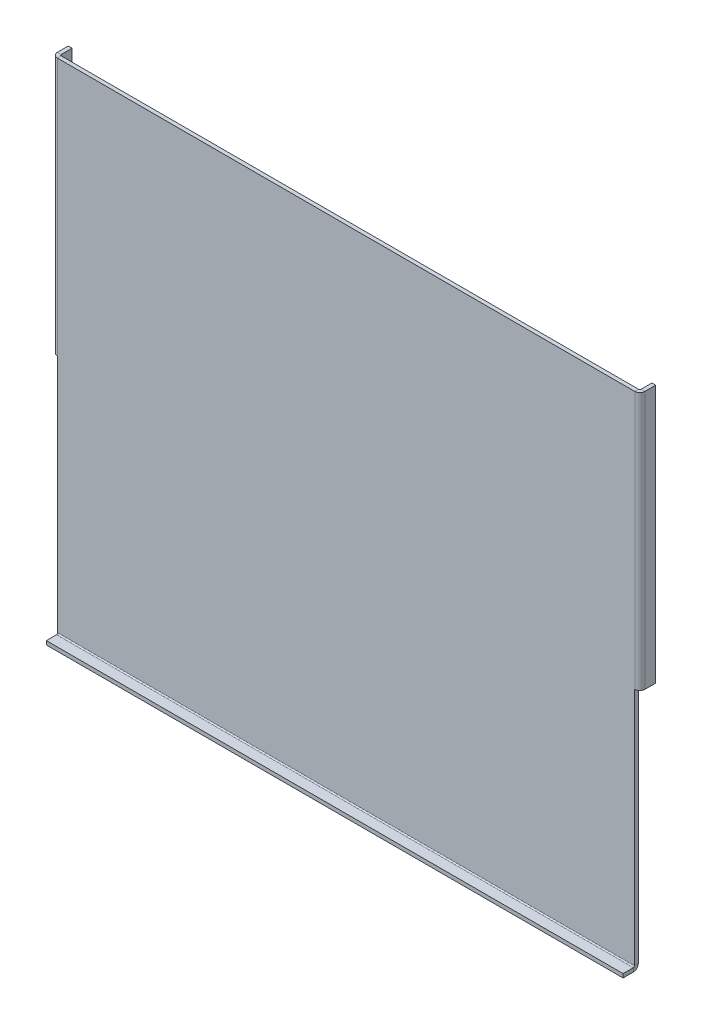
ISO-10303-21;
HEADER;
FILE_DESCRIPTION(('STEP AP214'),'2;1');
FILE_NAME('part.step','',(''),(''),'','','');
FILE_SCHEMA(('AUTOMOTIVE_DESIGN { 1 0 10303 214 1 1 1 1 }'));
ENDSEC;
DATA;
#1=APPLICATION_CONTEXT('core data for automotive mechanical design processes');
#2=APPLICATION_PROTOCOL_DEFINITION('international standard','automotive_design',2000,#1);
#3=PRODUCT_CONTEXT('',#1,'mechanical');
#4=PRODUCT('Part','Part','',(#3));
#5=PRODUCT_RELATED_PRODUCT_CATEGORY('part','',(#4));
#6=PRODUCT_DEFINITION_FORMATION('','',#4);
#7=PRODUCT_DEFINITION_CONTEXT('part definition',#1,'design');
#8=PRODUCT_DEFINITION('design','',#6,#7);
#9=PRODUCT_DEFINITION_SHAPE('','',#8);
#10=(LENGTH_UNIT() NAMED_UNIT(*) SI_UNIT(.MILLI.,.METRE.));
#11=(NAMED_UNIT(*) PLANE_ANGLE_UNIT() SI_UNIT($,.RADIAN.));
#12=(NAMED_UNIT(*) SI_UNIT($,.STERADIAN.) SOLID_ANGLE_UNIT());
#13=UNCERTAINTY_MEASURE_WITH_UNIT(LENGTH_MEASURE(1.E-05),#10,'distance_accuracy_value','');
#14=(GEOMETRIC_REPRESENTATION_CONTEXT(3) GLOBAL_UNCERTAINTY_ASSIGNED_CONTEXT((#13)) GLOBAL_UNIT_ASSIGNED_CONTEXT((#10,
#11,#12)) REPRESENTATION_CONTEXT('',''));
#15=CARTESIAN_POINT('',(0.,0.,0.));
#16=DIRECTION('',(0.,0.,1.));
#17=DIRECTION('',(1.,0.,0.));
#18=AXIS2_PLACEMENT_3D('',#15,#16,#17);
#19=CARTESIAN_POINT('',(241.3,210.185,-3.175));
#20=DIRECTION('',(1.,0.,0.));
#21=DIRECTION('',(0.,1.,0.));
#22=AXIS2_PLACEMENT_3D('',#19,#20,#21);
#23=PLANE('',#22);
#24=DIRECTION('',(0.,1.,0.));
#25=VECTOR('',#24,1.);
#26=CARTESIAN_POINT('',(241.3,210.185,-3.175));
#27=LINE('',#26,#25);
#28=CARTESIAN_POINT('',(241.3,-206.01,-3.175));
#29=VERTEX_POINT('',#28);
#30=CARTESIAN_POINT('',(241.3,-5.71500000000003,-3.17500000000002));
#31=VERTEX_POINT('',#30);
#32=EDGE_CURVE('E427',#29,#31,#27,.T.);
#33=ORIENTED_EDGE('',*,*,#32,.T.);
#34=DIRECTION('',(0.,0.,1.));
#35=VECTOR('',#34,1.);
#36=CARTESIAN_POINT('',(241.3,-5.71500000000003,-3.17500000000002));
#37=LINE('',#36,#35);
#38=CARTESIAN_POINT('',(241.3,-5.71500000000003,0.));
#39=VERTEX_POINT('',#38);
#40=EDGE_CURVE('E365',#31,#39,#37,.T.);
#41=ORIENTED_EDGE('',*,*,#40,.T.);
#42=DIRECTION('',(0.,1.,0.));
#43=VECTOR('',#42,1.);
#44=CARTESIAN_POINT('',(241.3,210.185,0.));
#45=LINE('',#44,#43);
#46=CARTESIAN_POINT('',(241.3,-206.01,0.));
#47=VERTEX_POINT('',#46);
#48=EDGE_CURVE('E424',#47,#39,#45,.T.);
#49=ORIENTED_EDGE('',*,*,#48,.F.);
#50=DIRECTION('',(0.,0.,-1.));
#51=VECTOR('',#50,1.);
#52=CARTESIAN_POINT('',(241.3,-206.01,0.));
#53=LINE('',#52,#51);
#54=EDGE_CURVE('E410',#47,#29,#53,.T.);
#55=ORIENTED_EDGE('',*,*,#54,.T.);
#56=EDGE_LOOP('',(#33,#41,#49,#55));
#57=FACE_BOUND('',#56,.T.);
#58=ADVANCED_FACE('F98',(#57),#23,.T.);
#59=CARTESIAN_POINT('',(0.,0.,-3.175));
#60=DIRECTION('',(0.,0.,1.));
#61=DIRECTION('',(1.,0.,0.));
#62=AXIS2_PLACEMENT_3D('',#59,#60,#61);
#63=PLANE('',#62);
#64=DIRECTION('',(1.,0.,0.));
#65=VECTOR('',#64,1.);
#66=CARTESIAN_POINT('',(241.3,-206.01,-3.175));
#67=LINE('',#66,#65);
#68=CARTESIAN_POINT('',(-241.3,-206.01,-3.175));
#69=VERTEX_POINT('',#68);
#70=EDGE_CURVE('E403',#29,#69,#67,.F.);
#71=ORIENTED_EDGE('',*,*,#70,.T.);
#72=DIRECTION('',(0.,-1.,0.));
#73=VECTOR('',#72,1.);
#74=CARTESIAN_POINT('',(-241.3,210.185,-3.175));
#75=LINE('',#74,#73);
#76=CARTESIAN_POINT('',(-241.3,-5.71500000000003,-3.175));
#77=VERTEX_POINT('',#76);
#78=EDGE_CURVE('E13',#77,#69,#75,.T.);
#79=ORIENTED_EDGE('',*,*,#78,.F.);
#80=DIRECTION('',(1.,0.,0.));
#81=VECTOR('',#80,1.);
#82=CARTESIAN_POINT('',(-241.57,-5.71500000000003,-3.17499999999994));
#83=LINE('',#82,#81);
#84=CARTESIAN_POINT('',(-241.57,-5.71500000000003,-3.17499999999994));
#85=VERTEX_POINT('',#84);
#86=EDGE_CURVE('E306',#85,#77,#83,.T.);
#87=ORIENTED_EDGE('',*,*,#86,.F.);
#88=DIRECTION('',(0.,1.,0.));
#89=VECTOR('',#88,1.);
#90=CARTESIAN_POINT('',(-241.57,210.185,-3.17499999999994));
#91=LINE('',#90,#89);
#92=CARTESIAN_POINT('',(-241.57,210.185,-3.17499999999994));
#93=VERTEX_POINT('',#92);
#94=EDGE_CURVE('E297',#93,#85,#91,.F.);
#95=ORIENTED_EDGE('',*,*,#94,.F.);
#96=DIRECTION('',(-1.,0.,0.));
#97=VECTOR('',#96,1.);
#98=CARTESIAN_POINT('',(-241.3,210.185,-3.175));
#99=LINE('',#98,#97);
#100=CARTESIAN_POINT('',(241.57,210.185,-3.17500000000003));
#101=VERTEX_POINT('',#100);
#102=EDGE_CURVE('E106',#101,#93,#99,.T.);
#103=ORIENTED_EDGE('',*,*,#102,.F.);
#104=DIRECTION('',(0.,-1.,0.));
#105=VECTOR('',#104,1.);
#106=CARTESIAN_POINT('',(241.57,-5.71500000000003,-3.17500000000003));
#107=LINE('',#106,#105);
#108=CARTESIAN_POINT('',(241.57,-5.71500000000003,-3.17500000000003));
#109=VERTEX_POINT('',#108);
#110=EDGE_CURVE('E358',#109,#101,#107,.F.);
#111=ORIENTED_EDGE('',*,*,#110,.F.);
#112=DIRECTION('',(-1.,0.,0.));
#113=VECTOR('',#112,1.);
#114=CARTESIAN_POINT('',(241.57,-5.71500000000003,-3.17500000000003));
#115=LINE('',#114,#113);
#116=EDGE_CURVE('E369',#109,#31,#115,.T.);
#117=ORIENTED_EDGE('',*,*,#116,.T.);
#118=ORIENTED_EDGE('',*,*,#32,.F.);
#119=EDGE_LOOP('',(#71,#79,#87,#95,#103,#111,#117,#118));
#120=FACE_BOUND('',#119,.T.);
#121=ADVANCED_FACE('F476',(#120),#63,.F.);
#122=CARTESIAN_POINT('',(0.,0.,0.));
#123=DIRECTION('',(0.,0.,1.));
#124=DIRECTION('',(1.,0.,0.));
#125=AXIS2_PLACEMENT_3D('',#122,#123,#124);
#126=PLANE('',#125);
#127=DIRECTION('',(-1.,0.,0.));
#128=VECTOR('',#127,1.);
#129=CARTESIAN_POINT('',(-241.3,210.185,0.));
#130=LINE('',#129,#128);
#131=CARTESIAN_POINT('',(241.57,210.185,0.));
#132=VERTEX_POINT('',#131);
#133=CARTESIAN_POINT('',(-241.57,210.185,0.));
#134=VERTEX_POINT('',#133);
#135=EDGE_CURVE('E433',#132,#134,#130,.T.);
#136=ORIENTED_EDGE('',*,*,#135,.T.);
#137=DIRECTION('',(0.,1.,0.));
#138=VECTOR('',#137,1.);
#139=CARTESIAN_POINT('',(-241.57,210.185,0.));
#140=LINE('',#139,#138);
#141=CARTESIAN_POINT('',(-241.57,-5.71500000000003,0.));
#142=VERTEX_POINT('',#141);
#143=EDGE_CURVE('E243',#134,#142,#140,.F.);
#144=ORIENTED_EDGE('',*,*,#143,.T.);
#145=DIRECTION('',(1.,0.,0.));
#146=VECTOR('',#145,1.);
#147=CARTESIAN_POINT('',(-241.57,-5.71500000000003,0.));
#148=LINE('',#147,#146);
#149=CARTESIAN_POINT('',(-241.3,-5.71500000000003,0.));
#150=VERTEX_POINT('',#149);
#151=EDGE_CURVE('E307',#142,#150,#148,.T.);
#152=ORIENTED_EDGE('',*,*,#151,.T.);
#153=DIRECTION('',(0.,-1.,0.));
#154=VECTOR('',#153,1.);
#155=CARTESIAN_POINT('',(-241.3,210.185,0.));
#156=LINE('',#155,#154);
#157=CARTESIAN_POINT('',(-241.3,-206.01,0.));
#158=VERTEX_POINT('',#157);
#159=EDGE_CURVE('E101',#150,#158,#156,.T.);
#160=ORIENTED_EDGE('',*,*,#159,.T.);
#161=DIRECTION('',(1.,0.,0.));
#162=VECTOR('',#161,1.);
#163=CARTESIAN_POINT('',(241.3,-206.01,0.));
#164=LINE('',#163,#162);
#165=EDGE_CURVE('E416',#47,#158,#164,.F.);
#166=ORIENTED_EDGE('',*,*,#165,.F.);
#167=ORIENTED_EDGE('',*,*,#48,.T.);
#168=DIRECTION('',(-1.,0.,0.));
#169=VECTOR('',#168,1.);
#170=CARTESIAN_POINT('',(241.57,-5.71500000000003,0.));
#171=LINE('',#170,#169);
#172=CARTESIAN_POINT('',(241.57,-5.71500000000003,0.));
#173=VERTEX_POINT('',#172);
#174=EDGE_CURVE('E121',#173,#39,#171,.T.);
#175=ORIENTED_EDGE('',*,*,#174,.F.);
#176=DIRECTION('',(0.,-1.,0.));
#177=VECTOR('',#176,1.);
#178=CARTESIAN_POINT('',(241.57,-5.71500000000003,0.));
#179=LINE('',#178,#177);
#180=EDGE_CURVE('E345',#173,#132,#179,.F.);
#181=ORIENTED_EDGE('',*,*,#180,.T.);
#182=EDGE_LOOP('',(#136,#144,#152,#160,#166,#167,#175,#181));
#183=FACE_BOUND('',#182,.T.);
#184=ADVANCED_FACE('F437',(#183),#126,.T.);
#185=CARTESIAN_POINT('',(-241.3,210.185,-3.175));
#186=DIRECTION('',(-1.,0.,0.));
#187=DIRECTION('',(0.,-1.,0.));
#188=AXIS2_PLACEMENT_3D('',#185,#186,#187);
#189=PLANE('',#188);
#190=DIRECTION('',(0.,0.,1.));
#191=VECTOR('',#190,1.);
#192=CARTESIAN_POINT('',(-241.3,-5.71500000000003,-3.17499999999994));
#193=LINE('',#192,#191);
#194=EDGE_CURVE('E113',#77,#150,#193,.T.);
#195=ORIENTED_EDGE('',*,*,#194,.F.);
#196=ORIENTED_EDGE('',*,*,#78,.T.);
#197=DIRECTION('',(0.,0.,-1.));
#198=VECTOR('',#197,1.);
#199=CARTESIAN_POINT('',(-241.3,-206.01,0.));
#200=LINE('',#199,#198);
#201=EDGE_CURVE('E421',#158,#69,#200,.T.);
#202=ORIENTED_EDGE('',*,*,#201,.F.);
#203=ORIENTED_EDGE('',*,*,#159,.F.);
#204=EDGE_LOOP('',(#195,#196,#202,#203));
#205=FACE_BOUND('',#204,.T.);
#206=ADVANCED_FACE('F440',(#205),#189,.T.);
#207=CARTESIAN_POINT('',(-241.3,210.185,-3.175));
#208=DIRECTION('',(0.,1.,0.));
#209=DIRECTION('',(0.,0.,1.));
#210=AXIS2_PLACEMENT_3D('',#207,#208,#209);
#211=PLANE('',#210);
#212=ORIENTED_EDGE('',*,*,#135,.F.);
#213=DIRECTION('',(0.,0.,1.));
#214=VECTOR('',#213,1.);
#215=CARTESIAN_POINT('',(241.57,210.185,-3.17500000000003));
#216=LINE('',#215,#214);
#217=EDGE_CURVE('E362',#101,#132,#216,.T.);
#218=ORIENTED_EDGE('',*,*,#217,.F.);
#219=ORIENTED_EDGE('',*,*,#102,.T.);
#220=DIRECTION('',(0.,0.,1.));
#221=VECTOR('',#220,1.);
#222=CARTESIAN_POINT('',(-241.57,210.185,-3.17499999999994));
#223=LINE('',#222,#221);
#224=EDGE_CURVE('E293',#93,#134,#223,.T.);
#225=ORIENTED_EDGE('',*,*,#224,.T.);
#226=EDGE_LOOP('',(#212,#218,#219,#225));
#227=FACE_BOUND('',#226,.T.);
#228=ADVANCED_FACE('F513',(#227),#211,.T.);
#229=CARTESIAN_POINT('',(-241.3,-206.01,1.));
#230=DIRECTION('',(-1.,0.,0.));
#231=DIRECTION('',(0.,0.,1.));
#232=AXIS2_PLACEMENT_3D('',#229,#230,#231);
#233=PLANE('',#232);
#234=DIRECTION('',(0.,-1.,0.));
#235=VECTOR('',#234,1.);
#236=CARTESIAN_POINT('',(-241.3,-210.185,0.999999999999992));
#237=LINE('',#236,#235);
#238=CARTESIAN_POINT('',(-241.3,-207.01,1.));
#239=VERTEX_POINT('',#238);
#240=CARTESIAN_POINT('',(-241.3,-210.185,0.999999999999992));
#241=VERTEX_POINT('',#240);
#242=EDGE_CURVE('E371',#239,#241,#237,.T.);
#243=ORIENTED_EDGE('',*,*,#242,.F.);
#244=CARTESIAN_POINT('',(-241.3,-206.01,1.));
#245=DIRECTION('',(1.,0.,0.));
#246=DIRECTION('',(0.,0.,-1.));
#247=AXIS2_PLACEMENT_3D('',#244,#245,#246);
#248=CIRCLE('',#247,1.);
#249=EDGE_CURVE('E413',#158,#239,#248,.F.);
#250=ORIENTED_EDGE('',*,*,#249,.F.);
#251=ORIENTED_EDGE('',*,*,#201,.T.);
#252=CARTESIAN_POINT('',(-241.3,-206.01,1.));
#253=DIRECTION('',(1.,0.,0.));
#254=DIRECTION('',(0.,0.,-1.));
#255=AXIS2_PLACEMENT_3D('',#252,#253,#254);
#256=CIRCLE('',#255,4.175);
#257=EDGE_CURVE('E406',#69,#241,#256,.F.);
#258=ORIENTED_EDGE('',*,*,#257,.T.);
#259=EDGE_LOOP('',(#243,#250,#251,#258));
#260=FACE_BOUND('',#259,.T.);
#261=ADVANCED_FACE('F448',(#260),#233,.T.);
#262=CARTESIAN_POINT('',(241.3,-206.01,1.));
#263=DIRECTION('',(-1.,0.,0.));
#264=DIRECTION('',(0.,0.,1.));
#265=AXIS2_PLACEMENT_3D('',#262,#263,#264);
#266=PLANE('',#265);
#267=CARTESIAN_POINT('',(241.3,-206.01,1.));
#268=DIRECTION('',(1.,0.,0.));
#269=DIRECTION('',(0.,0.,-1.));
#270=AXIS2_PLACEMENT_3D('',#267,#268,#269);
#271=CIRCLE('',#270,1.);
#272=CARTESIAN_POINT('',(241.3,-207.01,1.));
#273=VERTEX_POINT('',#272);
#274=EDGE_CURVE('E374',#273,#47,#271,.T.);
#275=ORIENTED_EDGE('',*,*,#274,.F.);
#276=DIRECTION('',(0.,-1.,0.));
#277=VECTOR('',#276,1.);
#278=CARTESIAN_POINT('',(241.3,-207.01,1.));
#279=LINE('',#278,#277);
#280=CARTESIAN_POINT('',(241.3,-210.185,0.999999999999992));
#281=VERTEX_POINT('',#280);
#282=EDGE_CURVE('E396',#273,#281,#279,.T.);
#283=ORIENTED_EDGE('',*,*,#282,.T.);
#284=CARTESIAN_POINT('',(241.3,-206.01,1.));
#285=DIRECTION('',(1.,0.,0.));
#286=DIRECTION('',(0.,0.,-1.));
#287=AXIS2_PLACEMENT_3D('',#284,#285,#286);
#288=CIRCLE('',#287,4.175);
#289=EDGE_CURVE('E407',#281,#29,#288,.T.);
#290=ORIENTED_EDGE('',*,*,#289,.T.);
#291=ORIENTED_EDGE('',*,*,#54,.F.);
#292=EDGE_LOOP('',(#275,#283,#290,#291));
#293=FACE_BOUND('',#292,.T.);
#294=ADVANCED_FACE('F469',(#293),#266,.F.);
#295=CARTESIAN_POINT('',(241.3,-206.01,1.));
#296=DIRECTION('',(1.,0.,0.));
#297=DIRECTION('',(0.,-1.,0.));
#298=AXIS2_PLACEMENT_3D('',#295,#296,#297);
#299=CYLINDRICAL_SURFACE('',#298,4.175);
#300=ORIENTED_EDGE('',*,*,#70,.F.);
#301=ORIENTED_EDGE('',*,*,#289,.F.);
#302=DIRECTION('',(1.,0.,0.));
#303=VECTOR('',#302,1.);
#304=CARTESIAN_POINT('',(-241.3,-210.185,0.999999999999992));
#305=LINE('',#304,#303);
#306=EDGE_CURVE('E394',#281,#241,#305,.F.);
#307=ORIENTED_EDGE('',*,*,#306,.T.);
#308=ORIENTED_EDGE('',*,*,#257,.F.);
#309=EDGE_LOOP('',(#300,#301,#307,#308));
#310=FACE_BOUND('',#309,.T.);
#311=ADVANCED_FACE('F474',(#310),#299,.T.);
#312=CARTESIAN_POINT('',(241.3,-206.01,1.));
#313=DIRECTION('',(1.,0.,0.));
#314=DIRECTION('',(0.,-1.,0.));
#315=AXIS2_PLACEMENT_3D('',#312,#313,#314);
#316=CYLINDRICAL_SURFACE('',#315,1.);
#317=ORIENTED_EDGE('',*,*,#165,.T.);
#318=ORIENTED_EDGE('',*,*,#249,.T.);
#319=DIRECTION('',(1.,0.,0.));
#320=VECTOR('',#319,1.);
#321=CARTESIAN_POINT('',(-241.3,-207.01,1.));
#322=LINE('',#321,#320);
#323=EDGE_CURVE('E399',#239,#273,#322,.T.);
#324=ORIENTED_EDGE('',*,*,#323,.T.);
#325=ORIENTED_EDGE('',*,*,#274,.T.);
#326=EDGE_LOOP('',(#317,#318,#324,#325));
#327=FACE_BOUND('',#326,.T.);
#328=ADVANCED_FACE('F445',(#327),#316,.F.);
#329=CARTESIAN_POINT('',(241.3,-210.185,9.52499999999994));
#330=DIRECTION('',(1.,0.,0.));
#331=DIRECTION('',(0.,0.,-1.));
#332=AXIS2_PLACEMENT_3D('',#329,#330,#331);
#333=PLANE('',#332);
#334=DIRECTION('',(0.,0.,1.));
#335=VECTOR('',#334,1.);
#336=CARTESIAN_POINT('',(241.3,-210.185,9.52499999999994));
#337=LINE('',#336,#335);
#338=CARTESIAN_POINT('',(241.3,-210.185,9.52499999999994));
#339=VERTEX_POINT('',#338);
#340=EDGE_CURVE('E378',#339,#281,#337,.F.);
#341=ORIENTED_EDGE('',*,*,#340,.T.);
#342=ORIENTED_EDGE('',*,*,#282,.F.);
#343=DIRECTION('',(0.,0.,-1.));
#344=VECTOR('',#343,1.);
#345=CARTESIAN_POINT('',(241.3,-207.01,0.));
#346=LINE('',#345,#344);
#347=CARTESIAN_POINT('',(241.3,-207.01,9.52499999999995));
#348=VERTEX_POINT('',#347);
#349=EDGE_CURVE('E386',#348,#273,#346,.T.);
#350=ORIENTED_EDGE('',*,*,#349,.F.);
#351=DIRECTION('',(0.,1.,0.));
#352=VECTOR('',#351,1.);
#353=CARTESIAN_POINT('',(241.3,-210.185,9.52499999999994));
#354=LINE('',#353,#352);
#355=EDGE_CURVE('E372',#339,#348,#354,.T.);
#356=ORIENTED_EDGE('',*,*,#355,.F.);
#357=EDGE_LOOP('',(#341,#342,#350,#356));
#358=FACE_BOUND('',#357,.T.);
#359=ADVANCED_FACE('F467',(#358),#333,.T.);
#360=CARTESIAN_POINT('',(-241.3,-210.185,0.));
#361=DIRECTION('',(-1.,0.,0.));
#362=DIRECTION('',(0.,0.,1.));
#363=AXIS2_PLACEMENT_3D('',#360,#361,#362);
#364=PLANE('',#363);
#365=DIRECTION('',(0.,0.,1.));
#366=VECTOR('',#365,1.);
#367=CARTESIAN_POINT('',(-241.3,-207.01,-6.12473035251548E-13));
#368=LINE('',#367,#366);
#369=CARTESIAN_POINT('',(-241.3,-207.01,9.52500000000001));
#370=VERTEX_POINT('',#369);
#371=EDGE_CURVE('E392',#239,#370,#368,.T.);
#372=ORIENTED_EDGE('',*,*,#371,.F.);
#373=ORIENTED_EDGE('',*,*,#242,.T.);
#374=DIRECTION('',(0.,0.,-1.));
#375=VECTOR('',#374,1.);
#376=CARTESIAN_POINT('',(-241.3,-210.185,0.));
#377=LINE('',#376,#375);
#378=CARTESIAN_POINT('',(-241.3,-210.185,9.525));
#379=VERTEX_POINT('',#378);
#380=EDGE_CURVE('E384',#241,#379,#377,.F.);
#381=ORIENTED_EDGE('',*,*,#380,.T.);
#382=DIRECTION('',(0.,1.,0.));
#383=VECTOR('',#382,1.);
#384=CARTESIAN_POINT('',(-241.3,-210.185,9.525));
#385=LINE('',#384,#383);
#386=EDGE_CURVE('E375',#379,#370,#385,.T.);
#387=ORIENTED_EDGE('',*,*,#386,.T.);
#388=EDGE_LOOP('',(#372,#373,#381,#387));
#389=FACE_BOUND('',#388,.T.);
#390=ADVANCED_FACE('F452',(#389),#364,.T.);
#391=CARTESIAN_POINT('',(0.,-210.185,-6.23558488502375E-13));
#392=DIRECTION('',(0.,1.,0.));
#393=DIRECTION('',(0.,0.,1.));
#394=AXIS2_PLACEMENT_3D('',#391,#392,#393);
#395=PLANE('',#394);
#396=ORIENTED_EDGE('',*,*,#306,.F.);
#397=ORIENTED_EDGE('',*,*,#340,.F.);
#398=DIRECTION('',(-1.,0.,0.));
#399=VECTOR('',#398,1.);
#400=CARTESIAN_POINT('',(-241.3,-210.185,9.525));
#401=LINE('',#400,#399);
#402=EDGE_CURVE('E381',#379,#339,#401,.F.);
#403=ORIENTED_EDGE('',*,*,#402,.F.);
#404=ORIENTED_EDGE('',*,*,#380,.F.);
#405=EDGE_LOOP('',(#396,#397,#403,#404));
#406=FACE_BOUND('',#405,.T.);
#407=ADVANCED_FACE('F457',(#406),#395,.F.);
#408=CARTESIAN_POINT('',(0.,-207.01,-6.12473035251548E-13));
#409=DIRECTION('',(0.,1.,0.));
#410=DIRECTION('',(0.,0.,1.));
#411=AXIS2_PLACEMENT_3D('',#408,#409,#410);
#412=PLANE('',#411);
#413=ORIENTED_EDGE('',*,*,#349,.T.);
#414=ORIENTED_EDGE('',*,*,#323,.F.);
#415=ORIENTED_EDGE('',*,*,#371,.T.);
#416=DIRECTION('',(1.,0.,0.));
#417=VECTOR('',#416,1.);
#418=CARTESIAN_POINT('',(0.,-207.01,9.52499999999998));
#419=LINE('',#418,#417);
#420=EDGE_CURVE('E389',#370,#348,#419,.T.);
#421=ORIENTED_EDGE('',*,*,#420,.T.);
#422=EDGE_LOOP('',(#413,#414,#415,#421));
#423=FACE_BOUND('',#422,.T.);
#424=ADVANCED_FACE('F464',(#423),#412,.T.);
#425=CARTESIAN_POINT('',(-241.3,-210.185,9.525));
#426=DIRECTION('',(0.,0.,1.));
#427=DIRECTION('',(0.,-1.,0.));
#428=AXIS2_PLACEMENT_3D('',#425,#426,#427);
#429=PLANE('',#428);
#430=ORIENTED_EDGE('',*,*,#420,.F.);
#431=ORIENTED_EDGE('',*,*,#386,.F.);
#432=ORIENTED_EDGE('',*,*,#402,.T.);
#433=ORIENTED_EDGE('',*,*,#355,.T.);
#434=EDGE_LOOP('',(#430,#431,#432,#433));
#435=FACE_BOUND('',#434,.T.);
#436=ADVANCED_FACE('F461',(#435),#429,.T.);
#437=CARTESIAN_POINT('',(241.57,-5.71500000000003,-3.17500000000003));
#438=DIRECTION('',(0.,-1.,0.));
#439=DIRECTION('',(0.,0.,1.));
#440=AXIS2_PLACEMENT_3D('',#437,#438,#439);
#441=PLANE('',#440);
#442=ORIENTED_EDGE('',*,*,#116,.F.);
#443=DIRECTION('',(0.,0.,1.));
#444=VECTOR('',#443,1.);
#445=CARTESIAN_POINT('',(241.57,-5.71500000000003,-3.17500000000003));
#446=LINE('',#445,#444);
#447=EDGE_CURVE('E352',#109,#173,#446,.T.);
#448=ORIENTED_EDGE('',*,*,#447,.T.);
#449=ORIENTED_EDGE('',*,*,#174,.T.);
#450=ORIENTED_EDGE('',*,*,#40,.F.);
#451=EDGE_LOOP('',(#442,#448,#449,#450));
#452=FACE_BOUND('',#451,.T.);
#453=ADVANCED_FACE('F481',(#452),#441,.T.);
#454=CARTESIAN_POINT('',(241.57,210.185,-4.175));
#455=DIRECTION('',(0.,1.,0.));
#456=DIRECTION('',(0.,0.,1.));
#457=AXIS2_PLACEMENT_3D('',#454,#455,#456);
#458=PLANE('',#457);
#459=DIRECTION('',(1.,0.,0.));
#460=VECTOR('',#459,1.);
#461=CARTESIAN_POINT('',(245.745,210.185,-4.175));
#462=LINE('',#461,#460);
#463=CARTESIAN_POINT('',(242.57,210.185,-4.175));
#464=VERTEX_POINT('',#463);
#465=CARTESIAN_POINT('',(245.745,210.185,-4.17499999999999));
#466=VERTEX_POINT('',#465);
#467=EDGE_CURVE('E310',#464,#466,#462,.T.);
#468=ORIENTED_EDGE('',*,*,#467,.F.);
#469=CARTESIAN_POINT('',(241.57,210.185,-4.175));
#470=DIRECTION('',(0.,-1.,0.));
#471=DIRECTION('',(0.,0.,-1.));
#472=AXIS2_PLACEMENT_3D('',#469,#470,#471);
#473=CIRCLE('',#472,0.999999999999973);
#474=EDGE_CURVE('E355',#101,#464,#473,.F.);
#475=ORIENTED_EDGE('',*,*,#474,.F.);
#476=ORIENTED_EDGE('',*,*,#217,.T.);
#477=CARTESIAN_POINT('',(241.57,210.185,-4.175));
#478=DIRECTION('',(0.,-1.,0.));
#479=DIRECTION('',(0.,0.,-1.));
#480=AXIS2_PLACEMENT_3D('',#477,#478,#479);
#481=CIRCLE('',#480,4.17499999999997);
#482=EDGE_CURVE('E348',#132,#466,#481,.F.);
#483=ORIENTED_EDGE('',*,*,#482,.T.);
#484=EDGE_LOOP('',(#468,#475,#476,#483));
#485=FACE_BOUND('',#484,.T.);
#486=ADVANCED_FACE('F510',(#485),#458,.T.);
#487=CARTESIAN_POINT('',(241.57,-5.71500000000003,-4.175));
#488=DIRECTION('',(0.,1.,0.));
#489=DIRECTION('',(0.,0.,1.));
#490=AXIS2_PLACEMENT_3D('',#487,#488,#489);
#491=PLANE('',#490);
#492=CARTESIAN_POINT('',(241.57,-5.71500000000003,-4.175));
#493=DIRECTION('',(0.,-1.,0.));
#494=DIRECTION('',(0.,0.,-1.));
#495=AXIS2_PLACEMENT_3D('',#492,#493,#494);
#496=CIRCLE('',#495,0.999999999999973);
#497=CARTESIAN_POINT('',(242.57,-5.71500000000003,-4.175));
#498=VERTEX_POINT('',#497);
#499=EDGE_CURVE('E315',#498,#109,#496,.T.);
#500=ORIENTED_EDGE('',*,*,#499,.F.);
#501=DIRECTION('',(1.,0.,0.));
#502=VECTOR('',#501,1.);
#503=CARTESIAN_POINT('',(242.57,-5.71500000000003,-4.17499999999998));
#504=LINE('',#503,#502);
#505=CARTESIAN_POINT('',(245.745,-5.71500000000002,-4.17499999999998));
#506=VERTEX_POINT('',#505);
#507=EDGE_CURVE('E338',#498,#506,#504,.T.);
#508=ORIENTED_EDGE('',*,*,#507,.T.);
#509=CARTESIAN_POINT('',(241.57,-5.71500000000003,-4.175));
#510=DIRECTION('',(0.,-1.,0.));
#511=DIRECTION('',(0.,0.,-1.));
#512=AXIS2_PLACEMENT_3D('',#509,#510,#511);
#513=CIRCLE('',#512,4.17499999999997);
#514=EDGE_CURVE('E349',#506,#173,#513,.T.);
#515=ORIENTED_EDGE('',*,*,#514,.T.);
#516=ORIENTED_EDGE('',*,*,#447,.F.);
#517=EDGE_LOOP('',(#500,#508,#515,#516));
#518=FACE_BOUND('',#517,.T.);
#519=ADVANCED_FACE('F484',(#518),#491,.F.);
#520=CARTESIAN_POINT('',(241.57,-5.71500000000003,-4.175));
#521=DIRECTION('',(0.,-1.,0.));
#522=DIRECTION('',(1.,0.,0.));
#523=AXIS2_PLACEMENT_3D('',#520,#521,#522);
#524=CYLINDRICAL_SURFACE('',#523,4.17499999999997);
#525=ORIENTED_EDGE('',*,*,#180,.F.);
#526=ORIENTED_EDGE('',*,*,#514,.F.);
#527=DIRECTION('',(0.,-1.,0.));
#528=VECTOR('',#527,1.);
#529=CARTESIAN_POINT('',(245.745,0.,-4.17499999999998));
#530=LINE('',#529,#528);
#531=EDGE_CURVE('E335',#466,#506,#530,.T.);
#532=ORIENTED_EDGE('',*,*,#531,.F.);
#533=ORIENTED_EDGE('',*,*,#482,.F.);
#534=EDGE_LOOP('',(#525,#526,#532,#533));
#535=FACE_BOUND('',#534,.T.);
#536=ADVANCED_FACE('F508',(#535),#524,.T.);
#537=CARTESIAN_POINT('',(241.57,-5.71500000000003,-4.175));
#538=DIRECTION('',(0.,-1.,0.));
#539=DIRECTION('',(1.,0.,0.));
#540=AXIS2_PLACEMENT_3D('',#537,#538,#539);
#541=CYLINDRICAL_SURFACE('',#540,0.999999999999973);
#542=ORIENTED_EDGE('',*,*,#110,.T.);
#543=ORIENTED_EDGE('',*,*,#474,.T.);
#544=DIRECTION('',(0.,1.,0.));
#545=VECTOR('',#544,1.);
#546=CARTESIAN_POINT('',(242.57,210.185,-4.17500000000001));
#547=LINE('',#546,#545);
#548=EDGE_CURVE('E341',#464,#498,#547,.F.);
#549=ORIENTED_EDGE('',*,*,#548,.T.);
#550=ORIENTED_EDGE('',*,*,#499,.T.);
#551=EDGE_LOOP('',(#542,#543,#549,#550));
#552=FACE_BOUND('',#551,.T.);
#553=ADVANCED_FACE('F486',(#552),#541,.F.);
#554=CARTESIAN_POINT('',(245.745,-5.71500000000002,-3.17499999999995));
#555=DIRECTION('',(0.,-1.,0.));
#556=DIRECTION('',(1.,0.,0.));
#557=AXIS2_PLACEMENT_3D('',#554,#555,#556);
#558=PLANE('',#557);
#559=DIRECTION('',(0.,0.,1.));
#560=VECTOR('',#559,1.);
#561=CARTESIAN_POINT('',(245.745,-5.71500000000002,-3.17499999999995));
#562=LINE('',#561,#560);
#563=CARTESIAN_POINT('',(245.745,-5.71500000000002,-13.295953566832));
#564=VERTEX_POINT('',#563);
#565=EDGE_CURVE('E319',#564,#506,#562,.T.);
#566=ORIENTED_EDGE('',*,*,#565,.T.);
#567=ORIENTED_EDGE('',*,*,#507,.F.);
#568=DIRECTION('',(0.,0.,-1.));
#569=VECTOR('',#568,1.);
#570=CARTESIAN_POINT('',(242.57,-5.71500000000003,6.61738081478781E-13));
#571=LINE('',#570,#569);
#572=CARTESIAN_POINT('',(242.57,-5.71500000000003,-13.295953566832));
#573=VERTEX_POINT('',#572);
#574=EDGE_CURVE('E327',#573,#498,#571,.F.);
#575=ORIENTED_EDGE('',*,*,#574,.F.);
#576=DIRECTION('',(-1.,0.,0.));
#577=VECTOR('',#576,1.);
#578=CARTESIAN_POINT('',(245.745,-5.71500000000002,-13.295953566832));
#579=LINE('',#578,#577);
#580=EDGE_CURVE('E313',#564,#573,#579,.T.);
#581=ORIENTED_EDGE('',*,*,#580,.F.);
#582=EDGE_LOOP('',(#566,#567,#575,#581));
#583=FACE_BOUND('',#582,.T.);
#584=ADVANCED_FACE('F503',(#583),#558,.T.);
#585=CARTESIAN_POINT('',(245.745,210.185,-13.295953566832));
#586=DIRECTION('',(0.,1.,0.));
#587=DIRECTION('',(0.,0.,1.));
#588=AXIS2_PLACEMENT_3D('',#585,#586,#587);
#589=PLANE('',#588);
#590=DIRECTION('',(0.,0.,1.));
#591=VECTOR('',#590,1.);
#592=CARTESIAN_POINT('',(242.57,210.185,2.39096417334307E-12));
#593=LINE('',#592,#591);
#594=CARTESIAN_POINT('',(242.57,210.185,-13.295953566832));
#595=VERTEX_POINT('',#594);
#596=EDGE_CURVE('E333',#464,#595,#593,.F.);
#597=ORIENTED_EDGE('',*,*,#596,.F.);
#598=ORIENTED_EDGE('',*,*,#467,.T.);
#599=DIRECTION('',(0.,0.,-1.));
#600=VECTOR('',#599,1.);
#601=CARTESIAN_POINT('',(245.745,210.185,-13.295953566832));
#602=LINE('',#601,#600);
#603=CARTESIAN_POINT('',(245.745,210.185,-13.295953566832));
#604=VERTEX_POINT('',#603);
#605=EDGE_CURVE('E325',#466,#604,#602,.T.);
#606=ORIENTED_EDGE('',*,*,#605,.T.);
#607=DIRECTION('',(-1.,0.,0.));
#608=VECTOR('',#607,1.);
#609=CARTESIAN_POINT('',(245.745,210.185,-13.295953566832));
#610=LINE('',#609,#608);
#611=EDGE_CURVE('E316',#604,#595,#610,.T.);
#612=ORIENTED_EDGE('',*,*,#611,.T.);
#613=EDGE_LOOP('',(#597,#598,#606,#612));
#614=FACE_BOUND('',#613,.T.);
#615=ADVANCED_FACE('F495',(#614),#589,.T.);
#616=CARTESIAN_POINT('',(245.745,0.,6.72823534729608E-13));
#617=DIRECTION('',(1.,0.,0.));
#618=DIRECTION('',(0.,0.,-1.));
#619=AXIS2_PLACEMENT_3D('',#616,#617,#618);
#620=PLANE('',#619);
#621=ORIENTED_EDGE('',*,*,#605,.F.);
#622=ORIENTED_EDGE('',*,*,#531,.T.);
#623=ORIENTED_EDGE('',*,*,#565,.F.);
#624=DIRECTION('',(0.,-1.,0.));
#625=VECTOR('',#624,1.);
#626=CARTESIAN_POINT('',(245.745,-5.71500000000002,-13.295953566832));
#627=LINE('',#626,#625);
#628=EDGE_CURVE('E322',#604,#564,#627,.T.);
#629=ORIENTED_EDGE('',*,*,#628,.F.);
#630=EDGE_LOOP('',(#621,#622,#623,#629));
#631=FACE_BOUND('',#630,.T.);
#632=ADVANCED_FACE('F506',(#631),#620,.T.);
#633=CARTESIAN_POINT('',(242.57,0.,6.61738081478781E-13));
#634=DIRECTION('',(1.,0.,0.));
#635=DIRECTION('',(0.,0.,-1.));
#636=AXIS2_PLACEMENT_3D('',#633,#634,#635);
#637=PLANE('',#636);
#638=ORIENTED_EDGE('',*,*,#548,.F.);
#639=ORIENTED_EDGE('',*,*,#596,.T.);
#640=DIRECTION('',(0.,1.,0.));
#641=VECTOR('',#640,1.);
#642=CARTESIAN_POINT('',(242.57,0.,-13.295953566832));
#643=LINE('',#642,#641);
#644=EDGE_CURVE('E330',#595,#573,#643,.F.);
#645=ORIENTED_EDGE('',*,*,#644,.T.);
#646=ORIENTED_EDGE('',*,*,#574,.T.);
#647=EDGE_LOOP('',(#638,#639,#645,#646));
#648=FACE_BOUND('',#647,.T.);
#649=ADVANCED_FACE('F491',(#648),#637,.F.);
#650=CARTESIAN_POINT('',(245.745,-5.71500000000002,-13.295953566832));
#651=DIRECTION('',(0.,0.,-1.));
#652=DIRECTION('',(-1.,0.,0.));
#653=AXIS2_PLACEMENT_3D('',#650,#651,#652);
#654=PLANE('',#653);
#655=ORIENTED_EDGE('',*,*,#644,.F.);
#656=ORIENTED_EDGE('',*,*,#611,.F.);
#657=ORIENTED_EDGE('',*,*,#628,.T.);
#658=ORIENTED_EDGE('',*,*,#580,.T.);
#659=EDGE_LOOP('',(#655,#656,#657,#658));
#660=FACE_BOUND('',#659,.T.);
#661=ADVANCED_FACE('F501',(#660),#654,.T.);
#662=CARTESIAN_POINT('',(-241.57,-5.71500000000003,-3.17499999999994));
#663=DIRECTION('',(0.,1.,0.));
#664=DIRECTION('',(0.,0.,1.));
#665=AXIS2_PLACEMENT_3D('',#662,#663,#664);
#666=PLANE('',#665);
#667=ORIENTED_EDGE('',*,*,#151,.F.);
#668=DIRECTION('',(0.,0.,1.));
#669=VECTOR('',#668,1.);
#670=CARTESIAN_POINT('',(-241.57,-5.71500000000003,-3.17499999999994));
#671=LINE('',#670,#669);
#672=EDGE_CURVE('E300',#85,#142,#671,.T.);
#673=ORIENTED_EDGE('',*,*,#672,.F.);
#674=ORIENTED_EDGE('',*,*,#86,.T.);
#675=ORIENTED_EDGE('',*,*,#194,.T.);
#676=EDGE_LOOP('',(#667,#673,#674,#675));
#677=FACE_BOUND('',#676,.T.);
#678=ADVANCED_FACE('F585',(#677),#666,.F.);
#679=CARTESIAN_POINT('',(-241.57,-5.71500000000003,-4.17499999999997));
#680=DIRECTION('',(0.,-1.,0.));
#681=DIRECTION('',(0.,0.,-1.));
#682=AXIS2_PLACEMENT_3D('',#679,#680,#681);
#683=PLANE('',#682);
#684=DIRECTION('',(1.,0.,0.));
#685=VECTOR('',#684,1.);
#686=CARTESIAN_POINT('',(-245.745,-5.71500000000002,-4.17499999999995));
#687=LINE('',#686,#685);
#688=CARTESIAN_POINT('',(-242.57,-5.71500000000003,-4.17499999999997));
#689=VERTEX_POINT('',#688);
#690=CARTESIAN_POINT('',(-245.745,-5.71500000000003,-4.17499999999996));
#691=VERTEX_POINT('',#690);
#692=EDGE_CURVE('E288',#689,#691,#687,.F.);
#693=ORIENTED_EDGE('',*,*,#692,.F.);
#694=CARTESIAN_POINT('',(-241.57,-5.71500000000003,-4.17499999999997));
#695=DIRECTION('',(0.,1.,0.));
#696=DIRECTION('',(0.,0.,1.));
#697=AXIS2_PLACEMENT_3D('',#694,#695,#696);
#698=CIRCLE('',#697,1.00000000000003);
#699=EDGE_CURVE('E246',#85,#689,#698,.F.);
#700=ORIENTED_EDGE('',*,*,#699,.F.);
#701=ORIENTED_EDGE('',*,*,#672,.T.);
#702=CARTESIAN_POINT('',(-241.57,-5.71500000000003,-4.17499999999997));
#703=DIRECTION('',(0.,1.,0.));
#704=DIRECTION('',(0.,0.,1.));
#705=AXIS2_PLACEMENT_3D('',#702,#703,#704);
#706=CIRCLE('',#705,4.17500000000003);
#707=EDGE_CURVE('E292',#142,#691,#706,.F.);
#708=ORIENTED_EDGE('',*,*,#707,.T.);
#709=EDGE_LOOP('',(#693,#700,#701,#708));
#710=FACE_BOUND('',#709,.T.);
#711=ADVANCED_FACE('F594',(#710),#683,.T.);
#712=CARTESIAN_POINT('',(-241.57,210.185,-4.17499999999997));
#713=DIRECTION('',(0.,-1.,0.));
#714=DIRECTION('',(0.,0.,-1.));
#715=AXIS2_PLACEMENT_3D('',#712,#713,#714);
#716=PLANE('',#715);
#717=CARTESIAN_POINT('',(-241.57,210.185,-4.17499999999997));
#718=DIRECTION('',(0.,1.,0.));
#719=DIRECTION('',(0.,0.,1.));
#720=AXIS2_PLACEMENT_3D('',#717,#718,#719);
#721=CIRCLE('',#720,1.00000000000003);
#722=CARTESIAN_POINT('',(-242.57,210.185,-4.17499999999997));
#723=VERTEX_POINT('',#722);
#724=EDGE_CURVE('E253',#723,#93,#721,.T.);
#725=ORIENTED_EDGE('',*,*,#724,.F.);
#726=DIRECTION('',(1.,0.,0.));
#727=VECTOR('',#726,1.);
#728=CARTESIAN_POINT('',(-242.57,210.185,-4.17499999999998));
#729=LINE('',#728,#727);
#730=CARTESIAN_POINT('',(-245.745,210.185,-4.17499999999998));
#731=VERTEX_POINT('',#730);
#732=EDGE_CURVE('E250',#723,#731,#729,.F.);
#733=ORIENTED_EDGE('',*,*,#732,.T.);
#734=CARTESIAN_POINT('',(-241.57,210.185,-4.17499999999997));
#735=DIRECTION('',(0.,1.,0.));
#736=DIRECTION('',(0.,0.,1.));
#737=AXIS2_PLACEMENT_3D('',#734,#735,#736);
#738=CIRCLE('',#737,4.17500000000003);
#739=EDGE_CURVE('E236',#731,#134,#738,.T.);
#740=ORIENTED_EDGE('',*,*,#739,.T.);
#741=ORIENTED_EDGE('',*,*,#224,.F.);
#742=EDGE_LOOP('',(#725,#733,#740,#741));
#743=FACE_BOUND('',#742,.T.);
#744=ADVANCED_FACE('F251',(#743),#716,.F.);
#745=CARTESIAN_POINT('',(-241.57,210.185,-4.17499999999997));
#746=DIRECTION('',(0.,1.,0.));
#747=DIRECTION('',(-1.,0.,0.));
#748=AXIS2_PLACEMENT_3D('',#745,#746,#747);
#749=CYLINDRICAL_SURFACE('',#748,4.17500000000003);
#750=ORIENTED_EDGE('',*,*,#143,.F.);
#751=ORIENTED_EDGE('',*,*,#739,.F.);
#752=DIRECTION('',(0.,1.,0.));
#753=VECTOR('',#752,1.);
#754=CARTESIAN_POINT('',(-245.745,0.,-4.17499999999995));
#755=LINE('',#754,#753);
#756=EDGE_CURVE('E240',#691,#731,#755,.T.);
#757=ORIENTED_EDGE('',*,*,#756,.F.);
#758=ORIENTED_EDGE('',*,*,#707,.F.);
#759=EDGE_LOOP('',(#750,#751,#757,#758));
#760=FACE_BOUND('',#759,.T.);
#761=ADVANCED_FACE('F238',(#760),#749,.T.);
#762=CARTESIAN_POINT('',(-241.57,210.185,-4.17499999999997));
#763=DIRECTION('',(0.,1.,0.));
#764=DIRECTION('',(-1.,0.,0.));
#765=AXIS2_PLACEMENT_3D('',#762,#763,#764);
#766=CYLINDRICAL_SURFACE('',#765,1.00000000000003);
#767=ORIENTED_EDGE('',*,*,#94,.T.);
#768=ORIENTED_EDGE('',*,*,#699,.T.);
#769=DIRECTION('',(0.,-1.,0.));
#770=VECTOR('',#769,1.);
#771=CARTESIAN_POINT('',(-242.57,-5.71500000000003,-4.17499999999996));
#772=LINE('',#771,#770);
#773=EDGE_CURVE('E257',#689,#723,#772,.F.);
#774=ORIENTED_EDGE('',*,*,#773,.T.);
#775=ORIENTED_EDGE('',*,*,#724,.T.);
#776=EDGE_LOOP('',(#767,#768,#774,#775));
#777=FACE_BOUND('',#776,.T.);
#778=ADVANCED_FACE('F516',(#777),#766,.F.);
#779=CARTESIAN_POINT('',(-245.745,210.185,-13.295953566832));
#780=DIRECTION('',(0.,-1.,0.));
#781=DIRECTION('',(0.,0.,-1.));
#782=AXIS2_PLACEMENT_3D('',#779,#780,#781);
#783=PLANE('',#782);
#784=ORIENTED_EDGE('',*,*,#732,.F.);
#785=DIRECTION('',(0.,0.,-1.));
#786=VECTOR('',#785,1.);
#787=CARTESIAN_POINT('',(-242.57,210.185,-13.295953566832));
#788=LINE('',#787,#786);
#789=CARTESIAN_POINT('',(-242.57,210.185,-13.295953566832));
#790=VERTEX_POINT('',#789);
#791=EDGE_CURVE('E281',#723,#790,#788,.T.);
#792=ORIENTED_EDGE('',*,*,#791,.T.);
#793=DIRECTION('',(1.,0.,0.));
#794=VECTOR('',#793,1.);
#795=CARTESIAN_POINT('',(-245.745,210.185,-13.295953566832));
#796=LINE('',#795,#794);
#797=CARTESIAN_POINT('',(-245.745,210.185,-13.295953566832));
#798=VERTEX_POINT('',#797);
#799=EDGE_CURVE('E270',#798,#790,#796,.T.);
#800=ORIENTED_EDGE('',*,*,#799,.F.);
#801=DIRECTION('',(0.,0.,1.));
#802=VECTOR('',#801,1.);
#803=CARTESIAN_POINT('',(-245.745,210.185,2.4020496265939E-12));
#804=LINE('',#803,#802);
#805=EDGE_CURVE('E262',#731,#798,#804,.F.);
#806=ORIENTED_EDGE('',*,*,#805,.F.);
#807=EDGE_LOOP('',(#784,#792,#800,#806));
#808=FACE_BOUND('',#807,.T.);
#809=ADVANCED_FACE('F268',(#808),#783,.F.);
#810=CARTESIAN_POINT('',(-245.745,-5.71500000000002,-3.17499999999995));
#811=DIRECTION('',(0.,1.,0.));
#812=DIRECTION('',(-1.,0.,0.));
#813=AXIS2_PLACEMENT_3D('',#810,#811,#812);
#814=PLANE('',#813);
#815=ORIENTED_EDGE('',*,*,#692,.T.);
#816=DIRECTION('',(0.,0.,-1.));
#817=VECTOR('',#816,1.);
#818=CARTESIAN_POINT('',(-245.745,-5.71500000000002,6.72823534729608E-13));
#819=LINE('',#818,#817);
#820=CARTESIAN_POINT('',(-245.745,-5.71500000000002,-13.295953566832));
#821=VERTEX_POINT('',#820);
#822=EDGE_CURVE('E265',#821,#691,#819,.F.);
#823=ORIENTED_EDGE('',*,*,#822,.F.);
#824=DIRECTION('',(1.,0.,0.));
#825=VECTOR('',#824,1.);
#826=CARTESIAN_POINT('',(-245.745,-5.71500000000002,-13.295953566832));
#827=LINE('',#826,#825);
#828=CARTESIAN_POINT('',(-242.57,-5.71500000000003,-13.295953566832));
#829=VERTEX_POINT('',#828);
#830=EDGE_CURVE('E272',#821,#829,#827,.T.);
#831=ORIENTED_EDGE('',*,*,#830,.T.);
#832=DIRECTION('',(0.,0.,1.));
#833=VECTOR('',#832,1.);
#834=CARTESIAN_POINT('',(-242.57,-5.71500000000003,-3.17499999999996));
#835=LINE('',#834,#833);
#836=EDGE_CURVE('E266',#829,#689,#835,.T.);
#837=ORIENTED_EDGE('',*,*,#836,.T.);
#838=EDGE_LOOP('',(#815,#823,#831,#837));
#839=FACE_BOUND('',#838,.T.);
#840=ADVANCED_FACE('F524',(#839),#814,.F.);
#841=CARTESIAN_POINT('',(-245.745,0.,6.72823534729608E-13));
#842=DIRECTION('',(-1.,0.,0.));
#843=DIRECTION('',(0.,0.,-1.));
#844=AXIS2_PLACEMENT_3D('',#841,#842,#843);
#845=PLANE('',#844);
#846=ORIENTED_EDGE('',*,*,#822,.T.);
#847=ORIENTED_EDGE('',*,*,#756,.T.);
#848=ORIENTED_EDGE('',*,*,#805,.T.);
#849=DIRECTION('',(0.,1.,0.));
#850=VECTOR('',#849,1.);
#851=CARTESIAN_POINT('',(-245.745,0.,-13.295953566832));
#852=LINE('',#851,#850);
#853=EDGE_CURVE('E273',#798,#821,#852,.F.);
#854=ORIENTED_EDGE('',*,*,#853,.T.);
#855=EDGE_LOOP('',(#846,#847,#848,#854));
#856=FACE_BOUND('',#855,.T.);
#857=ADVANCED_FACE('F261',(#856),#845,.T.);
#858=CARTESIAN_POINT('',(-242.57,0.,6.61738081478781E-13));
#859=DIRECTION('',(-1.,0.,0.));
#860=DIRECTION('',(0.,0.,-1.));
#861=AXIS2_PLACEMENT_3D('',#858,#859,#860);
#862=PLANE('',#861);
#863=ORIENTED_EDGE('',*,*,#773,.F.);
#864=ORIENTED_EDGE('',*,*,#836,.F.);
#865=DIRECTION('',(0.,-1.,0.));
#866=VECTOR('',#865,1.);
#867=CARTESIAN_POINT('',(-242.57,-5.71500000000003,-13.295953566832));
#868=LINE('',#867,#866);
#869=EDGE_CURVE('E283',#790,#829,#868,.T.);
#870=ORIENTED_EDGE('',*,*,#869,.F.);
#871=ORIENTED_EDGE('',*,*,#791,.F.);
#872=EDGE_LOOP('',(#863,#864,#870,#871));
#873=FACE_BOUND('',#872,.T.);
#874=ADVANCED_FACE('F521',(#873),#862,.F.);
#875=CARTESIAN_POINT('',(-245.745,-5.71500000000002,-13.295953566832));
#876=DIRECTION('',(0.,0.,1.));
#877=DIRECTION('',(1.,0.,0.));
#878=AXIS2_PLACEMENT_3D('',#875,#876,#877);
#879=PLANE('',#878);
#880=ORIENTED_EDGE('',*,*,#869,.T.);
#881=ORIENTED_EDGE('',*,*,#830,.F.);
#882=ORIENTED_EDGE('',*,*,#853,.F.);
#883=ORIENTED_EDGE('',*,*,#799,.T.);
#884=EDGE_LOOP('',(#880,#881,#882,#883));
#885=FACE_BOUND('',#884,.T.);
#886=ADVANCED_FACE('F527',(#885),#879,.F.);
#887=CLOSED_SHELL('',(#58,#121,#184,#206,#228,#261,#294,#311,#328,#359,#390,#407,#424,#436,#453,
#486,#519,#536,#553,#584,#615,#632,#649,#661,#678,#711,#744,#761,#778,#809,#840,#857,#874,#886));
#888=MANIFOLD_SOLID_BREP('B2',#887);
#889=ADVANCED_BREP_SHAPE_REPRESENTATION('',(#18,#888),#14);
#890=SHAPE_DEFINITION_REPRESENTATION(#9,#889);
ENDSEC;
END-ISO-10303-21;
